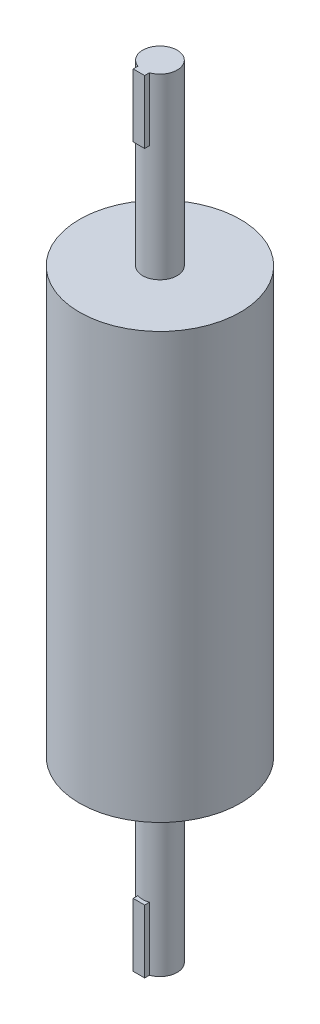
ISO-10303-21;
HEADER;
FILE_DESCRIPTION(('STEP AP214'),'2;1');
FILE_NAME('part.step','',(''),(''),'','','');
FILE_SCHEMA(('AUTOMOTIVE_DESIGN { 1 0 10303 214 1 1 1 1 }'));
ENDSEC;
DATA;
#1=APPLICATION_CONTEXT('core data for automotive mechanical design processes');
#2=APPLICATION_PROTOCOL_DEFINITION('international standard','automotive_design',2000,#1);
#3=PRODUCT_CONTEXT('',#1,'mechanical');
#4=PRODUCT('Part','Part','',(#3));
#5=PRODUCT_RELATED_PRODUCT_CATEGORY('part','',(#4));
#6=PRODUCT_DEFINITION_FORMATION('','',#4);
#7=PRODUCT_DEFINITION_CONTEXT('part definition',#1,'design');
#8=PRODUCT_DEFINITION('design','',#6,#7);
#9=PRODUCT_DEFINITION_SHAPE('','',#8);
#10=(LENGTH_UNIT() NAMED_UNIT(*) SI_UNIT(.MILLI.,.METRE.));
#11=(NAMED_UNIT(*) PLANE_ANGLE_UNIT() SI_UNIT($,.RADIAN.));
#12=(NAMED_UNIT(*) SI_UNIT($,.STERADIAN.) SOLID_ANGLE_UNIT());
#13=UNCERTAINTY_MEASURE_WITH_UNIT(LENGTH_MEASURE(1.E-05),#10,'distance_accuracy_value','');
#14=(GEOMETRIC_REPRESENTATION_CONTEXT(3) GLOBAL_UNCERTAINTY_ASSIGNED_CONTEXT((#13)) GLOBAL_UNIT_ASSIGNED_CONTEXT((#10,
#11,#12)) REPRESENTATION_CONTEXT('',''));
#15=CARTESIAN_POINT('',(0.,0.,0.));
#16=DIRECTION('',(0.,0.,1.));
#17=DIRECTION('',(1.,0.,0.));
#18=AXIS2_PLACEMENT_3D('',#15,#16,#17);
#19=CARTESIAN_POINT('',(0.,370.,0.));
#20=DIRECTION('',(0.,-1.,0.));
#21=DIRECTION('',(0.,0.,-1.));
#22=AXIS2_PLACEMENT_3D('',#19,#20,#21);
#23=CYLINDRICAL_SURFACE('',#22,70.);
#24=CARTESIAN_POINT('',(0.,370.,0.));
#25=DIRECTION('',(0.,1.,0.));
#26=DIRECTION('',(0.,0.,1.));
#27=AXIS2_PLACEMENT_3D('',#24,#25,#26);
#28=CIRCLE('',#27,70.);
#29=CARTESIAN_POINT('',(0.,370.,70.));
#30=VERTEX_POINT('',#29);
#31=EDGE_CURVE('E54',#30,#30,#28,.T.);
#32=ORIENTED_EDGE('',*,*,#31,.F.);
#33=EDGE_LOOP('',(#32));
#34=FACE_BOUND('',#33,.T.);
#35=CARTESIAN_POINT('',(0.,0.,0.));
#36=DIRECTION('',(0.,1.,0.));
#37=DIRECTION('',(0.,0.,1.));
#38=AXIS2_PLACEMENT_3D('',#35,#36,#37);
#39=CIRCLE('',#38,70.);
#40=CARTESIAN_POINT('',(0.,0.,70.));
#41=VERTEX_POINT('',#40);
#42=EDGE_CURVE('E210',#41,#41,#39,.T.);
#43=ORIENTED_EDGE('',*,*,#42,.T.);
#44=EDGE_LOOP('',(#43));
#45=FACE_BOUND('',#44,.T.);
#46=ADVANCED_FACE('F45',(#34,#45),#23,.T.);
#47=CARTESIAN_POINT('',(0.,370.,0.));
#48=DIRECTION('',(0.,1.,0.));
#49=DIRECTION('',(0.,0.,1.));
#50=AXIS2_PLACEMENT_3D('',#47,#48,#49);
#51=PLANE('',#50);
#52=CARTESIAN_POINT('',(0.,370.,0.));
#53=DIRECTION('',(0.,1.,0.));
#54=DIRECTION('',(0.,0.,1.));
#55=AXIS2_PLACEMENT_3D('',#52,#53,#54);
#56=CIRCLE('',#55,15.);
#57=CARTESIAN_POINT('',(0.,370.,15.));
#58=VERTEX_POINT('',#57);
#59=EDGE_CURVE('E11',#58,#58,#56,.T.);
#60=ORIENTED_EDGE('',*,*,#59,.F.);
#61=EDGE_LOOP('',(#60));
#62=FACE_BOUND('',#61,.T.);
#63=ORIENTED_EDGE('',*,*,#31,.T.);
#64=EDGE_LOOP('',(#63));
#65=FACE_BOUND('',#64,.T.);
#66=ADVANCED_FACE('F232',(#62,#65),#51,.T.);
#67=CARTESIAN_POINT('',(0.,0.,0.));
#68=DIRECTION('',(0.,1.,0.));
#69=DIRECTION('',(0.,0.,1.));
#70=AXIS2_PLACEMENT_3D('',#67,#68,#69);
#71=PLANE('',#70);
#72=CARTESIAN_POINT('',(0.,0.,0.));
#73=DIRECTION('',(0.,1.,0.));
#74=DIRECTION('',(0.,0.,1.));
#75=AXIS2_PLACEMENT_3D('',#72,#73,#74);
#76=CIRCLE('',#75,15.);
#77=CARTESIAN_POINT('',(0.,0.,15.));
#78=VERTEX_POINT('',#77);
#79=EDGE_CURVE('E48',#78,#78,#76,.T.);
#80=ORIENTED_EDGE('',*,*,#79,.T.);
#81=EDGE_LOOP('',(#80));
#82=FACE_BOUND('',#81,.T.);
#83=ORIENTED_EDGE('',*,*,#42,.F.);
#84=EDGE_LOOP('',(#83));
#85=FACE_BOUND('',#84,.T.);
#86=ADVANCED_FACE('F219',(#82,#85),#71,.F.);
#87=CARTESIAN_POINT('',(0.,470.,0.));
#88=DIRECTION('',(0.,-1.,0.));
#89=DIRECTION('',(0.,0.,-1.));
#90=AXIS2_PLACEMENT_3D('',#87,#88,#89);
#91=CYLINDRICAL_SURFACE('',#90,15.);
#92=DIRECTION('',(0.,-1.,0.));
#93=VECTOR('',#92,1.);
#94=CARTESIAN_POINT('',(-5.,-100.,14.142135623731));
#95=LINE('',#94,#93);
#96=CARTESIAN_POINT('',(-5.,-100.,14.142135623731));
#97=VERTEX_POINT('',#96);
#98=CARTESIAN_POINT('',(-5.,-155.,14.142135623731));
#99=VERTEX_POINT('',#98);
#100=EDGE_CURVE('E190',#97,#99,#95,.T.);
#101=ORIENTED_EDGE('',*,*,#100,.F.);
#102=CARTESIAN_POINT('',(0.,-100.,0.));
#103=DIRECTION('',(0.,1.,0.));
#104=DIRECTION('',(0.,0.,-1.));
#105=AXIS2_PLACEMENT_3D('',#102,#103,#104);
#106=CIRCLE('',#105,15.);
#107=CARTESIAN_POINT('',(5.,-100.,14.142135623731));
#108=VERTEX_POINT('',#107);
#109=EDGE_CURVE('E165',#97,#108,#106,.T.);
#110=ORIENTED_EDGE('',*,*,#109,.T.);
#111=DIRECTION('',(0.,-1.,0.));
#112=VECTOR('',#111,1.);
#113=CARTESIAN_POINT('',(5.,-100.,14.142135623731));
#114=LINE('',#113,#112);
#115=CARTESIAN_POINT('',(5.,-155.,14.142135623731));
#116=VERTEX_POINT('',#115);
#117=EDGE_CURVE('E181',#108,#116,#114,.T.);
#118=ORIENTED_EDGE('',*,*,#117,.T.);
#119=CARTESIAN_POINT('',(0.,-155.,0.));
#120=DIRECTION('',(0.,-1.,0.));
#121=DIRECTION('',(0.,0.,-1.));
#122=AXIS2_PLACEMENT_3D('',#119,#120,#121);
#123=CIRCLE('',#122,15.);
#124=EDGE_CURVE('E205',#99,#116,#123,.T.);
#125=ORIENTED_EDGE('',*,*,#124,.F.);
#126=EDGE_LOOP('',(#101,#110,#118,#125));
#127=FACE_BOUND('',#126,.T.);
#128=ORIENTED_EDGE('',*,*,#79,.F.);
#129=EDGE_LOOP('',(#128));
#130=FACE_BOUND('',#129,.T.);
#131=ADVANCED_FACE('F222',(#127,#130),#91,.T.);
#132=DIRECTION('',(0.,1.,0.));
#133=VECTOR('',#132,1.);
#134=CARTESIAN_POINT('',(5.,470.,14.142135623731));
#135=LINE('',#134,#133);
#136=CARTESIAN_POINT('',(5.,470.,14.142135623731));
#137=VERTEX_POINT('',#136);
#138=CARTESIAN_POINT('',(5.,525.,14.1421356237309));
#139=VERTEX_POINT('',#138);
#140=EDGE_CURVE('E142',#137,#139,#135,.T.);
#141=ORIENTED_EDGE('',*,*,#140,.F.);
#142=CARTESIAN_POINT('',(0.,470.,0.));
#143=DIRECTION('',(0.,-1.,0.));
#144=DIRECTION('',(0.,0.,1.));
#145=AXIS2_PLACEMENT_3D('',#142,#143,#144);
#146=CIRCLE('',#145,15.);
#147=CARTESIAN_POINT('',(-5.,470.,14.142135623731));
#148=VERTEX_POINT('',#147);
#149=EDGE_CURVE('E133',#137,#148,#146,.T.);
#150=ORIENTED_EDGE('',*,*,#149,.T.);
#151=DIRECTION('',(0.,1.,0.));
#152=VECTOR('',#151,1.);
#153=CARTESIAN_POINT('',(-5.,470.,14.142135623731));
#154=LINE('',#153,#152);
#155=CARTESIAN_POINT('',(-5.,525.,14.142135623731));
#156=VERTEX_POINT('',#155);
#157=EDGE_CURVE('E116',#148,#156,#154,.T.);
#158=ORIENTED_EDGE('',*,*,#157,.T.);
#159=CARTESIAN_POINT('',(0.,525.,0.));
#160=DIRECTION('',(0.,1.,0.));
#161=DIRECTION('',(0.,0.,1.));
#162=AXIS2_PLACEMENT_3D('',#159,#160,#161);
#163=CIRCLE('',#162,15.);
#164=EDGE_CURVE('E193',#139,#156,#163,.T.);
#165=ORIENTED_EDGE('',*,*,#164,.F.);
#166=EDGE_LOOP('',(#141,#150,#158,#165));
#167=FACE_BOUND('',#166,.T.);
#168=ORIENTED_EDGE('',*,*,#59,.T.);
#169=EDGE_LOOP('',(#168));
#170=FACE_BOUND('',#169,.T.);
#171=ADVANCED_FACE('F140',(#167,#170),#91,.T.);
#172=CARTESIAN_POINT('',(0.,-155.,0.));
#173=DIRECTION('',(0.,-1.,0.));
#174=DIRECTION('',(0.,0.,-1.));
#175=AXIS2_PLACEMENT_3D('',#172,#173,#174);
#176=PLANE('',#175);
#177=ORIENTED_EDGE('',*,*,#124,.T.);
#178=DIRECTION('',(0.,0.,1.));
#179=VECTOR('',#178,1.);
#180=CARTESIAN_POINT('',(5.,-155.,18.302135623731));
#181=LINE('',#180,#179);
#182=CARTESIAN_POINT('',(5.,-155.,18.302135623731));
#183=VERTEX_POINT('',#182);
#184=EDGE_CURVE('E159',#116,#183,#181,.T.);
#185=ORIENTED_EDGE('',*,*,#184,.T.);
#186=DIRECTION('',(-1.,0.,0.));
#187=VECTOR('',#186,1.);
#188=CARTESIAN_POINT('',(-5.,-155.,18.302135623731));
#189=LINE('',#188,#187);
#190=CARTESIAN_POINT('',(-5.,-155.,18.302135623731));
#191=VERTEX_POINT('',#190);
#192=EDGE_CURVE('E185',#183,#191,#189,.T.);
#193=ORIENTED_EDGE('',*,*,#192,.T.);
#194=DIRECTION('',(0.,0.,-1.));
#195=VECTOR('',#194,1.);
#196=CARTESIAN_POINT('',(-5.,-155.,14.142135623731));
#197=LINE('',#196,#195);
#198=EDGE_CURVE('E70',#191,#99,#197,.T.);
#199=ORIENTED_EDGE('',*,*,#198,.T.);
#200=EDGE_LOOP('',(#177,#185,#193,#199));
#201=FACE_BOUND('',#200,.T.);
#202=ADVANCED_FACE('F230',(#201),#176,.T.);
#203=CARTESIAN_POINT('',(0.,525.,0.));
#204=DIRECTION('',(0.,1.,0.));
#205=DIRECTION('',(0.,0.,1.));
#206=AXIS2_PLACEMENT_3D('',#203,#204,#205);
#207=PLANE('',#206);
#208=ORIENTED_EDGE('',*,*,#164,.T.);
#209=DIRECTION('',(0.,0.,1.));
#210=VECTOR('',#209,1.);
#211=CARTESIAN_POINT('',(-5.,525.,18.302135623731));
#212=LINE('',#211,#210);
#213=CARTESIAN_POINT('',(-5.,525.,18.302135623731));
#214=VERTEX_POINT('',#213);
#215=EDGE_CURVE('E121',#156,#214,#212,.T.);
#216=ORIENTED_EDGE('',*,*,#215,.T.);
#217=DIRECTION('',(1.,0.,0.));
#218=VECTOR('',#217,1.);
#219=CARTESIAN_POINT('',(5.,525.,18.302135623731));
#220=LINE('',#219,#218);
#221=CARTESIAN_POINT('',(5.,525.,18.302135623731));
#222=VERTEX_POINT('',#221);
#223=EDGE_CURVE('E146',#214,#222,#220,.T.);
#224=ORIENTED_EDGE('',*,*,#223,.T.);
#225=DIRECTION('',(0.,0.,-1.));
#226=VECTOR('',#225,1.);
#227=CARTESIAN_POINT('',(5.,525.,14.142135623731));
#228=LINE('',#227,#226);
#229=EDGE_CURVE('E62',#222,#139,#228,.T.);
#230=ORIENTED_EDGE('',*,*,#229,.T.);
#231=EDGE_LOOP('',(#208,#216,#224,#230));
#232=FACE_BOUND('',#231,.T.);
#233=ADVANCED_FACE('F267',(#232),#207,.T.);
#234=CARTESIAN_POINT('',(-5.,-100.,14.142135623731));
#235=DIRECTION('',(-1.,0.,0.));
#236=DIRECTION('',(0.,0.,1.));
#237=AXIS2_PLACEMENT_3D('',#234,#235,#236);
#238=PLANE('',#237);
#239=ORIENTED_EDGE('',*,*,#198,.F.);
#240=DIRECTION('',(0.,-1.,0.));
#241=VECTOR('',#240,1.);
#242=CARTESIAN_POINT('',(-5.,-100.,18.302135623731));
#243=LINE('',#242,#241);
#244=CARTESIAN_POINT('',(-5.,-100.,18.302135623731));
#245=VERTEX_POINT('',#244);
#246=EDGE_CURVE('E194',#245,#191,#243,.T.);
#247=ORIENTED_EDGE('',*,*,#246,.F.);
#248=DIRECTION('',(0.,0.,-1.));
#249=VECTOR('',#248,1.);
#250=CARTESIAN_POINT('',(-5.,-100.,14.142135623731));
#251=LINE('',#250,#249);
#252=EDGE_CURVE('E177',#245,#97,#251,.T.);
#253=ORIENTED_EDGE('',*,*,#252,.T.);
#254=ORIENTED_EDGE('',*,*,#100,.T.);
#255=EDGE_LOOP('',(#239,#247,#253,#254));
#256=FACE_BOUND('',#255,.T.);
#257=ADVANCED_FACE('F274',(#256),#238,.T.);
#258=CARTESIAN_POINT('',(-5.,-100.,18.302135623731));
#259=DIRECTION('',(0.,0.,1.));
#260=DIRECTION('',(1.,0.,0.));
#261=AXIS2_PLACEMENT_3D('',#258,#259,#260);
#262=PLANE('',#261);
#263=ORIENTED_EDGE('',*,*,#192,.F.);
#264=DIRECTION('',(0.,-1.,0.));
#265=VECTOR('',#264,1.);
#266=CARTESIAN_POINT('',(5.,-100.,18.302135623731));
#267=LINE('',#266,#265);
#268=CARTESIAN_POINT('',(5.,-100.,18.302135623731));
#269=VERTEX_POINT('',#268);
#270=EDGE_CURVE('E197',#269,#183,#267,.T.);
#271=ORIENTED_EDGE('',*,*,#270,.F.);
#272=DIRECTION('',(-1.,0.,0.));
#273=VECTOR('',#272,1.);
#274=CARTESIAN_POINT('',(-5.,-100.,18.302135623731));
#275=LINE('',#274,#273);
#276=EDGE_CURVE('E173',#269,#245,#275,.T.);
#277=ORIENTED_EDGE('',*,*,#276,.T.);
#278=ORIENTED_EDGE('',*,*,#246,.T.);
#279=EDGE_LOOP('',(#263,#271,#277,#278));
#280=FACE_BOUND('',#279,.T.);
#281=ADVANCED_FACE('F278',(#280),#262,.T.);
#282=CARTESIAN_POINT('',(5.,-100.,18.302135623731));
#283=DIRECTION('',(1.,0.,0.));
#284=DIRECTION('',(0.,0.,-1.));
#285=AXIS2_PLACEMENT_3D('',#282,#283,#284);
#286=PLANE('',#285);
#287=ORIENTED_EDGE('',*,*,#184,.F.);
#288=ORIENTED_EDGE('',*,*,#117,.F.);
#289=DIRECTION('',(0.,0.,1.));
#290=VECTOR('',#289,1.);
#291=CARTESIAN_POINT('',(5.,-100.,18.302135623731));
#292=LINE('',#291,#290);
#293=EDGE_CURVE('E169',#108,#269,#292,.T.);
#294=ORIENTED_EDGE('',*,*,#293,.T.);
#295=ORIENTED_EDGE('',*,*,#270,.T.);
#296=EDGE_LOOP('',(#287,#288,#294,#295));
#297=FACE_BOUND('',#296,.T.);
#298=ADVANCED_FACE('F289',(#297),#286,.T.);
#299=CARTESIAN_POINT('',(0.,-100.,0.));
#300=DIRECTION('',(0.,-1.,0.));
#301=DIRECTION('',(0.,0.,-1.));
#302=AXIS2_PLACEMENT_3D('',#299,#300,#301);
#303=PLANE('',#302);
#304=ORIENTED_EDGE('',*,*,#109,.F.);
#305=ORIENTED_EDGE('',*,*,#252,.F.);
#306=ORIENTED_EDGE('',*,*,#276,.F.);
#307=ORIENTED_EDGE('',*,*,#293,.F.);
#308=EDGE_LOOP('',(#304,#305,#306,#307));
#309=FACE_BOUND('',#308,.T.);
#310=ADVANCED_FACE('F300',(#309),#303,.F.);
#311=CARTESIAN_POINT('',(5.,470.,14.142135623731));
#312=DIRECTION('',(1.,0.,0.));
#313=DIRECTION('',(0.,0.,-1.));
#314=AXIS2_PLACEMENT_3D('',#311,#312,#313);
#315=PLANE('',#314);
#316=ORIENTED_EDGE('',*,*,#229,.F.);
#317=DIRECTION('',(0.,1.,0.));
#318=VECTOR('',#317,1.);
#319=CARTESIAN_POINT('',(5.,470.,18.302135623731));
#320=LINE('',#319,#318);
#321=CARTESIAN_POINT('',(5.,470.,18.302135623731));
#322=VERTEX_POINT('',#321);
#323=EDGE_CURVE('E160',#322,#222,#320,.T.);
#324=ORIENTED_EDGE('',*,*,#323,.F.);
#325=DIRECTION('',(0.,0.,-1.));
#326=VECTOR('',#325,1.);
#327=CARTESIAN_POINT('',(5.,470.,14.142135623731));
#328=LINE('',#327,#326);
#329=EDGE_CURVE('E127',#322,#137,#328,.T.);
#330=ORIENTED_EDGE('',*,*,#329,.T.);
#331=ORIENTED_EDGE('',*,*,#140,.T.);
#332=EDGE_LOOP('',(#316,#324,#330,#331));
#333=FACE_BOUND('',#332,.T.);
#334=ADVANCED_FACE('F311',(#333),#315,.T.);
#335=CARTESIAN_POINT('',(5.,470.,18.302135623731));
#336=DIRECTION('',(0.,0.,1.));
#337=DIRECTION('',(1.,0.,0.));
#338=AXIS2_PLACEMENT_3D('',#335,#336,#337);
#339=PLANE('',#338);
#340=ORIENTED_EDGE('',*,*,#223,.F.);
#341=DIRECTION('',(0.,1.,0.));
#342=VECTOR('',#341,1.);
#343=CARTESIAN_POINT('',(-5.,470.,18.302135623731));
#344=LINE('',#343,#342);
#345=CARTESIAN_POINT('',(-5.,470.,18.302135623731));
#346=VERTEX_POINT('',#345);
#347=EDGE_CURVE('E126',#346,#214,#344,.T.);
#348=ORIENTED_EDGE('',*,*,#347,.F.);
#349=DIRECTION('',(1.,0.,0.));
#350=VECTOR('',#349,1.);
#351=CARTESIAN_POINT('',(5.,470.,18.302135623731));
#352=LINE('',#351,#350);
#353=EDGE_CURVE('E136',#346,#322,#352,.T.);
#354=ORIENTED_EDGE('',*,*,#353,.T.);
#355=ORIENTED_EDGE('',*,*,#323,.T.);
#356=EDGE_LOOP('',(#340,#348,#354,#355));
#357=FACE_BOUND('',#356,.T.);
#358=ADVANCED_FACE('F335',(#357),#339,.T.);
#359=CARTESIAN_POINT('',(-5.,470.,18.302135623731));
#360=DIRECTION('',(-1.,0.,0.));
#361=DIRECTION('',(0.,0.,1.));
#362=AXIS2_PLACEMENT_3D('',#359,#360,#361);
#363=PLANE('',#362);
#364=ORIENTED_EDGE('',*,*,#215,.F.);
#365=ORIENTED_EDGE('',*,*,#157,.F.);
#366=DIRECTION('',(0.,0.,1.));
#367=VECTOR('',#366,1.);
#368=CARTESIAN_POINT('',(-5.,470.,18.302135623731));
#369=LINE('',#368,#367);
#370=EDGE_CURVE('E119',#148,#346,#369,.T.);
#371=ORIENTED_EDGE('',*,*,#370,.T.);
#372=ORIENTED_EDGE('',*,*,#347,.T.);
#373=EDGE_LOOP('',(#364,#365,#371,#372));
#374=FACE_BOUND('',#373,.T.);
#375=ADVANCED_FACE('F118',(#374),#363,.T.);
#376=CARTESIAN_POINT('',(0.,470.,0.));
#377=DIRECTION('',(0.,1.,0.));
#378=DIRECTION('',(0.,0.,1.));
#379=AXIS2_PLACEMENT_3D('',#376,#377,#378);
#380=PLANE('',#379);
#381=ORIENTED_EDGE('',*,*,#149,.F.);
#382=ORIENTED_EDGE('',*,*,#329,.F.);
#383=ORIENTED_EDGE('',*,*,#353,.F.);
#384=ORIENTED_EDGE('',*,*,#370,.F.);
#385=EDGE_LOOP('',(#381,#382,#383,#384));
#386=FACE_BOUND('',#385,.T.);
#387=ADVANCED_FACE('F131',(#386),#380,.F.);
#388=CLOSED_SHELL('',(#46,#66,#86,#131,#171,#202,#233,#257,#281,#298,#310,#334,#358,#375,#387));
#389=MANIFOLD_SOLID_BREP('B2',#388);
#390=ADVANCED_BREP_SHAPE_REPRESENTATION('',(#18,#389),#14);
#391=SHAPE_DEFINITION_REPRESENTATION(#9,#390);
ENDSEC;
END-ISO-10303-21;
